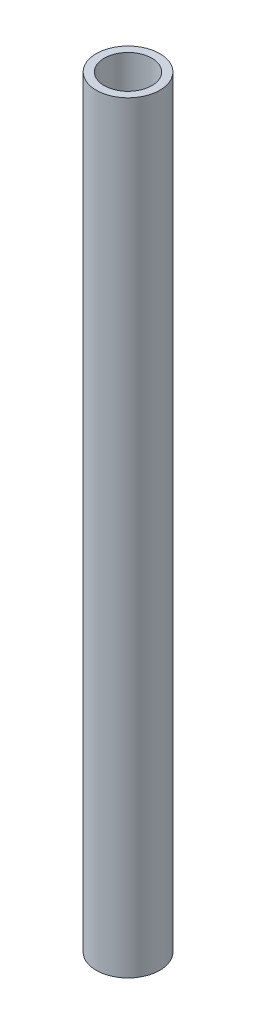
ISO-10303-21;
HEADER;
FILE_DESCRIPTION(('STEP AP214'),'2;1');
FILE_NAME('part.step','',(''),(''),'','','');
FILE_SCHEMA(('AUTOMOTIVE_DESIGN { 1 0 10303 214 1 1 1 1 }'));
ENDSEC;
DATA;
#1=APPLICATION_CONTEXT('core data for automotive mechanical design processes');
#2=APPLICATION_PROTOCOL_DEFINITION('international standard','automotive_design',2000,#1);
#3=PRODUCT_CONTEXT('',#1,'mechanical');
#4=PRODUCT('Part','Part','',(#3));
#5=PRODUCT_RELATED_PRODUCT_CATEGORY('part','',(#4));
#6=PRODUCT_DEFINITION_FORMATION('','',#4);
#7=PRODUCT_DEFINITION_CONTEXT('part definition',#1,'design');
#8=PRODUCT_DEFINITION('design','',#6,#7);
#9=PRODUCT_DEFINITION_SHAPE('','',#8);
#10=(LENGTH_UNIT() NAMED_UNIT(*) SI_UNIT(.MILLI.,.METRE.));
#11=(NAMED_UNIT(*) PLANE_ANGLE_UNIT() SI_UNIT($,.RADIAN.));
#12=(NAMED_UNIT(*) SI_UNIT($,.STERADIAN.) SOLID_ANGLE_UNIT());
#13=UNCERTAINTY_MEASURE_WITH_UNIT(LENGTH_MEASURE(1.E-05),#10,'distance_accuracy_value','');
#14=(GEOMETRIC_REPRESENTATION_CONTEXT(3) GLOBAL_UNCERTAINTY_ASSIGNED_CONTEXT((#13)) GLOBAL_UNIT_ASSIGNED_CONTEXT((#10,
#11,#12)) REPRESENTATION_CONTEXT('',''));
#15=CARTESIAN_POINT('',(0.,0.,0.));
#16=DIRECTION('',(0.,0.,1.));
#17=DIRECTION('',(1.,0.,0.));
#18=AXIS2_PLACEMENT_3D('',#15,#16,#17);
#19=CARTESIAN_POINT('',(0.,304.8,0.));
#20=DIRECTION('',(0.,1.,0.));
#21=DIRECTION('',(0.,0.,1.));
#22=AXIS2_PLACEMENT_3D('',#19,#20,#21);
#23=PLANE('',#22);
#24=CARTESIAN_POINT('',(0.,304.8,0.));
#25=DIRECTION('',(0.,1.,0.));
#26=DIRECTION('',(0.,0.,1.));
#27=AXIS2_PLACEMENT_3D('',#24,#25,#26);
#28=CIRCLE('',#27,12.7);
#29=CARTESIAN_POINT('',(0.,304.8,-12.7));
#30=VERTEX_POINT('',#29);
#31=EDGE_CURVE('E10',#30,#30,#28,.T.);
#32=ORIENTED_EDGE('',*,*,#31,.T.);
#33=EDGE_LOOP('',(#32));
#34=FACE_BOUND('',#33,.T.);
#35=CARTESIAN_POINT('',(0.,304.8,0.));
#36=DIRECTION('',(0.,1.,0.));
#37=DIRECTION('',(0.,0.,1.));
#38=AXIS2_PLACEMENT_3D('',#35,#36,#37);
#39=CIRCLE('',#38,9.525);
#40=CARTESIAN_POINT('',(0.,304.8,-9.525));
#41=VERTEX_POINT('',#40);
#42=EDGE_CURVE('E43',#41,#41,#39,.T.);
#43=ORIENTED_EDGE('',*,*,#42,.F.);
#44=EDGE_LOOP('',(#43));
#45=FACE_BOUND('',#44,.T.);
#46=ADVANCED_FACE('F32',(#34,#45),#23,.T.);
#47=CARTESIAN_POINT('',(0.,0.,0.));
#48=DIRECTION('',(0.,1.,0.));
#49=DIRECTION('',(0.,0.,1.));
#50=AXIS2_PLACEMENT_3D('',#47,#48,#49);
#51=PLANE('',#50);
#52=CARTESIAN_POINT('',(0.,0.,0.));
#53=DIRECTION('',(0.,1.,0.));
#54=DIRECTION('',(0.,0.,1.));
#55=AXIS2_PLACEMENT_3D('',#52,#53,#54);
#56=CIRCLE('',#55,12.7);
#57=CARTESIAN_POINT('',(0.,0.,-12.7));
#58=VERTEX_POINT('',#57);
#59=EDGE_CURVE('E36',#58,#58,#56,.T.);
#60=ORIENTED_EDGE('',*,*,#59,.F.);
#61=EDGE_LOOP('',(#60));
#62=FACE_BOUND('',#61,.T.);
#63=CARTESIAN_POINT('',(0.,0.,0.));
#64=DIRECTION('',(0.,1.,0.));
#65=DIRECTION('',(0.,0.,1.));
#66=AXIS2_PLACEMENT_3D('',#63,#64,#65);
#67=CIRCLE('',#66,9.525);
#68=CARTESIAN_POINT('',(0.,0.,-9.525));
#69=VERTEX_POINT('',#68);
#70=EDGE_CURVE('E45',#69,#69,#67,.T.);
#71=ORIENTED_EDGE('',*,*,#70,.T.);
#72=EDGE_LOOP('',(#71));
#73=FACE_BOUND('',#72,.T.);
#74=ADVANCED_FACE('F55',(#62,#73),#51,.F.);
#75=CARTESIAN_POINT('',(0.,304.8,0.));
#76=DIRECTION('',(0.,-1.,0.));
#77=DIRECTION('',(0.,0.,-1.));
#78=AXIS2_PLACEMENT_3D('',#75,#76,#77);
#79=CYLINDRICAL_SURFACE('',#78,12.7);
#80=CARTESIAN_POINT('',(0.,304.8,-12.7));
#81=CARTESIAN_POINT('',(0.,301.625,-12.7));
#82=CARTESIAN_POINT('',(0.,298.45,-12.7));
#83=CARTESIAN_POINT('',(0.,292.1,-12.7));
#84=CARTESIAN_POINT('',(0.,288.925,-12.7));
#85=CARTESIAN_POINT('',(0.,282.575,-12.7));
#86=CARTESIAN_POINT('',(0.,279.4,-12.7));
#87=CARTESIAN_POINT('',(0.,273.05,-12.7));
#88=CARTESIAN_POINT('',(0.,269.875,-12.7));
#89=CARTESIAN_POINT('',(0.,263.525,-12.7));
#90=CARTESIAN_POINT('',(0.,260.35,-12.7));
#91=CARTESIAN_POINT('',(0.,254.,-12.7));
#92=CARTESIAN_POINT('',(0.,250.825,-12.7));
#93=CARTESIAN_POINT('',(0.,244.475,-12.7));
#94=CARTESIAN_POINT('',(0.,241.3,-12.7));
#95=CARTESIAN_POINT('',(0.,234.95,-12.7));
#96=CARTESIAN_POINT('',(0.,231.775,-12.7));
#97=CARTESIAN_POINT('',(0.,225.425,-12.7));
#98=CARTESIAN_POINT('',(0.,222.25,-12.7));
#99=CARTESIAN_POINT('',(0.,215.9,-12.7));
#100=CARTESIAN_POINT('',(0.,212.725,-12.7));
#101=CARTESIAN_POINT('',(0.,206.375,-12.7));
#102=CARTESIAN_POINT('',(0.,203.2,-12.7));
#103=CARTESIAN_POINT('',(0.,196.85,-12.7));
#104=CARTESIAN_POINT('',(0.,193.675,-12.7));
#105=CARTESIAN_POINT('',(0.,187.325,-12.7));
#106=CARTESIAN_POINT('',(0.,184.15,-12.7));
#107=CARTESIAN_POINT('',(0.,177.8,-12.7));
#108=CARTESIAN_POINT('',(0.,174.625,-12.7));
#109=CARTESIAN_POINT('',(0.,168.275,-12.7));
#110=CARTESIAN_POINT('',(0.,165.1,-12.7));
#111=CARTESIAN_POINT('',(0.,158.75,-12.7));
#112=CARTESIAN_POINT('',(0.,155.575,-12.7));
#113=CARTESIAN_POINT('',(0.,149.225,-12.7));
#114=CARTESIAN_POINT('',(0.,146.05,-12.7));
#115=CARTESIAN_POINT('',(0.,139.7,-12.7));
#116=CARTESIAN_POINT('',(0.,136.525,-12.7));
#117=CARTESIAN_POINT('',(0.,130.175,-12.7));
#118=CARTESIAN_POINT('',(0.,127.,-12.7));
#119=CARTESIAN_POINT('',(0.,120.65,-12.7));
#120=CARTESIAN_POINT('',(0.,117.475,-12.7));
#121=CARTESIAN_POINT('',(0.,111.125,-12.7));
#122=CARTESIAN_POINT('',(0.,107.95,-12.7));
#123=CARTESIAN_POINT('',(0.,101.6,-12.7));
#124=CARTESIAN_POINT('',(0.,98.425,-12.7));
#125=CARTESIAN_POINT('',(0.,92.075,-12.7));
#126=CARTESIAN_POINT('',(0.,88.9,-12.7));
#127=CARTESIAN_POINT('',(0.,82.55,-12.7));
#128=CARTESIAN_POINT('',(0.,79.375,-12.7));
#129=CARTESIAN_POINT('',(0.,73.025,-12.7));
#130=CARTESIAN_POINT('',(0.,69.85,-12.7));
#131=CARTESIAN_POINT('',(0.,63.5,-12.7));
#132=CARTESIAN_POINT('',(0.,60.325,-12.7));
#133=CARTESIAN_POINT('',(0.,53.975,-12.7));
#134=CARTESIAN_POINT('',(0.,50.8,-12.7));
#135=CARTESIAN_POINT('',(0.,44.45,-12.7));
#136=CARTESIAN_POINT('',(0.,41.275,-12.7));
#137=CARTESIAN_POINT('',(0.,34.925,-12.7));
#138=CARTESIAN_POINT('',(0.,31.75,-12.7));
#139=CARTESIAN_POINT('',(0.,25.4,-12.7));
#140=CARTESIAN_POINT('',(0.,22.225,-12.7));
#141=CARTESIAN_POINT('',(0.,15.875,-12.7));
#142=CARTESIAN_POINT('',(0.,12.7,-12.7));
#143=CARTESIAN_POINT('',(0.,6.35,-12.7));
#144=CARTESIAN_POINT('',(0.,3.175,-12.7));
#145=CARTESIAN_POINT('',(0.,0.,-12.7));
#146=B_SPLINE_CURVE_WITH_KNOTS('',3,(#80,#81,#82,#83,#84,#85,#86,#87,#88,#89,#90,#91,#92,#93,
#94,#95,#96,#97,#98,#99,#100,#101,#102,#103,#104,#105,#106,#107,#108,#109,#110,#111,#112,#113,
#114,#115,#116,#117,#118,#119,#120,#121,#122,#123,#124,#125,#126,#127,#128,#129,#130,#131,#132,
#133,#134,#135,#136,#137,#138,#139,#140,#141,#142,#143,#144,#145),.UNSPECIFIED.,.F.,.F.,(4,2,2,
2,2,2,2,2,2,2,2,2,2,2,2,2,2,2,2,2,2,2,2,2,2,2,2,2,2,2,2,2,4),(0.,9.52500000000001,19.05,28.575,
38.1,47.625,57.15,66.675,76.2,85.7250000000001,95.2500000000001,104.775,114.3,123.825,133.35,
142.875,152.4,161.925,171.45,180.975,190.5,200.025,209.55,219.075,228.6,238.125,247.65,257.175,
266.7,276.225,285.75,295.275,304.8),.UNSPECIFIED.);
#147=EDGE_CURVE('BSEAM34',#30,#58,#146,.T.);
#148=ORIENTED_EDGE('',*,*,#31,.F.);
#149=ORIENTED_EDGE('',*,*,#59,.T.);
#150=ORIENTED_EDGE('',*,*,#147,.T.);
#151=ORIENTED_EDGE('',*,*,#147,.F.);
#152=EDGE_LOOP('',(#148,#150,#149,#151));
#153=FACE_BOUND('',#152,.T.);
#154=ADVANCED_FACE('F34',(#153),#79,.T.);
#155=CARTESIAN_POINT('',(0.,304.8,0.));
#156=DIRECTION('',(0.,-1.,0.));
#157=DIRECTION('',(0.,0.,-1.));
#158=AXIS2_PLACEMENT_3D('',#155,#156,#157);
#159=CYLINDRICAL_SURFACE('',#158,9.525);
#160=CARTESIAN_POINT('',(0.,304.8,-9.525));
#161=CARTESIAN_POINT('',(0.,301.625,-9.525));
#162=CARTESIAN_POINT('',(0.,298.45,-9.525));
#163=CARTESIAN_POINT('',(0.,292.1,-9.525));
#164=CARTESIAN_POINT('',(0.,288.925,-9.525));
#165=CARTESIAN_POINT('',(0.,282.575,-9.525));
#166=CARTESIAN_POINT('',(0.,279.4,-9.525));
#167=CARTESIAN_POINT('',(0.,273.05,-9.525));
#168=CARTESIAN_POINT('',(0.,269.875,-9.525));
#169=CARTESIAN_POINT('',(0.,263.525,-9.525));
#170=CARTESIAN_POINT('',(0.,260.35,-9.525));
#171=CARTESIAN_POINT('',(0.,254.,-9.525));
#172=CARTESIAN_POINT('',(0.,250.825,-9.525));
#173=CARTESIAN_POINT('',(0.,244.475,-9.525));
#174=CARTESIAN_POINT('',(0.,241.3,-9.525));
#175=CARTESIAN_POINT('',(0.,234.95,-9.525));
#176=CARTESIAN_POINT('',(0.,231.775,-9.525));
#177=CARTESIAN_POINT('',(0.,225.425,-9.525));
#178=CARTESIAN_POINT('',(0.,222.25,-9.525));
#179=CARTESIAN_POINT('',(0.,215.9,-9.525));
#180=CARTESIAN_POINT('',(0.,212.725,-9.525));
#181=CARTESIAN_POINT('',(0.,206.375,-9.525));
#182=CARTESIAN_POINT('',(0.,203.2,-9.525));
#183=CARTESIAN_POINT('',(0.,196.85,-9.525));
#184=CARTESIAN_POINT('',(0.,193.675,-9.525));
#185=CARTESIAN_POINT('',(0.,187.325,-9.525));
#186=CARTESIAN_POINT('',(0.,184.15,-9.525));
#187=CARTESIAN_POINT('',(0.,177.8,-9.525));
#188=CARTESIAN_POINT('',(0.,174.625,-9.525));
#189=CARTESIAN_POINT('',(0.,168.275,-9.525));
#190=CARTESIAN_POINT('',(0.,165.1,-9.525));
#191=CARTESIAN_POINT('',(0.,158.75,-9.525));
#192=CARTESIAN_POINT('',(0.,155.575,-9.525));
#193=CARTESIAN_POINT('',(0.,149.225,-9.525));
#194=CARTESIAN_POINT('',(0.,146.05,-9.525));
#195=CARTESIAN_POINT('',(0.,139.7,-9.525));
#196=CARTESIAN_POINT('',(0.,136.525,-9.525));
#197=CARTESIAN_POINT('',(0.,130.175,-9.525));
#198=CARTESIAN_POINT('',(0.,127.,-9.525));
#199=CARTESIAN_POINT('',(0.,120.65,-9.525));
#200=CARTESIAN_POINT('',(0.,117.475,-9.525));
#201=CARTESIAN_POINT('',(0.,111.125,-9.525));
#202=CARTESIAN_POINT('',(0.,107.95,-9.525));
#203=CARTESIAN_POINT('',(0.,101.6,-9.525));
#204=CARTESIAN_POINT('',(0.,98.425,-9.525));
#205=CARTESIAN_POINT('',(0.,92.075,-9.525));
#206=CARTESIAN_POINT('',(0.,88.9,-9.525));
#207=CARTESIAN_POINT('',(0.,82.55,-9.525));
#208=CARTESIAN_POINT('',(0.,79.375,-9.525));
#209=CARTESIAN_POINT('',(0.,73.025,-9.525));
#210=CARTESIAN_POINT('',(0.,69.85,-9.525));
#211=CARTESIAN_POINT('',(0.,63.5,-9.525));
#212=CARTESIAN_POINT('',(0.,60.325,-9.525));
#213=CARTESIAN_POINT('',(0.,53.975,-9.525));
#214=CARTESIAN_POINT('',(0.,50.8,-9.525));
#215=CARTESIAN_POINT('',(0.,44.45,-9.525));
#216=CARTESIAN_POINT('',(0.,41.275,-9.525));
#217=CARTESIAN_POINT('',(0.,34.925,-9.525));
#218=CARTESIAN_POINT('',(0.,31.75,-9.525));
#219=CARTESIAN_POINT('',(0.,25.4,-9.525));
#220=CARTESIAN_POINT('',(0.,22.225,-9.525));
#221=CARTESIAN_POINT('',(0.,15.875,-9.525));
#222=CARTESIAN_POINT('',(0.,12.7,-9.525));
#223=CARTESIAN_POINT('',(0.,6.35,-9.525));
#224=CARTESIAN_POINT('',(0.,3.175,-9.525));
#225=CARTESIAN_POINT('',(0.,0.,-9.525));
#226=B_SPLINE_CURVE_WITH_KNOTS('',3,(#160,#161,#162,#163,#164,#165,#166,#167,#168,#169,#170,
#171,#172,#173,#174,#175,#176,#177,#178,#179,#180,#181,#182,#183,#184,#185,#186,#187,#188,#189,
#190,#191,#192,#193,#194,#195,#196,#197,#198,#199,#200,#201,#202,#203,#204,#205,#206,#207,#208,
#209,#210,#211,#212,#213,#214,#215,#216,#217,#218,#219,#220,#221,#222,#223,#224,#225),
.UNSPECIFIED.,.F.,.F.,(4,2,2,2,2,2,2,2,2,2,2,2,2,2,2,2,2,2,2,2,2,2,2,2,2,2,2,2,2,2,2,2,4),(0.,
9.52499999999995,19.05,28.575,38.1,47.625,57.15,66.675,76.2,85.725,95.2499999999999,104.775,
114.3,123.825,133.35,142.875,152.4,161.925,171.45,180.975,190.5,200.025,209.55,219.075,228.6,
238.125,247.65,257.175,266.7,276.225,285.75,295.275,304.8),.UNSPECIFIED.);
#227=EDGE_CURVE('BSEAM51',#41,#69,#226,.T.);
#228=ORIENTED_EDGE('',*,*,#42,.T.);
#229=ORIENTED_EDGE('',*,*,#70,.F.);
#230=ORIENTED_EDGE('',*,*,#227,.T.);
#231=ORIENTED_EDGE('',*,*,#227,.F.);
#232=EDGE_LOOP('',(#228,#230,#229,#231));
#233=FACE_BOUND('',#232,.T.);
#234=ADVANCED_FACE('F51',(#233),#159,.F.);
#235=CLOSED_SHELL('',(#46,#74,#154,#234));
#236=MANIFOLD_SOLID_BREP('B2',#235);
#237=ADVANCED_BREP_SHAPE_REPRESENTATION('',(#18,#236),#14);
#238=SHAPE_DEFINITION_REPRESENTATION(#9,#237);
ENDSEC;
END-ISO-10303-21;
